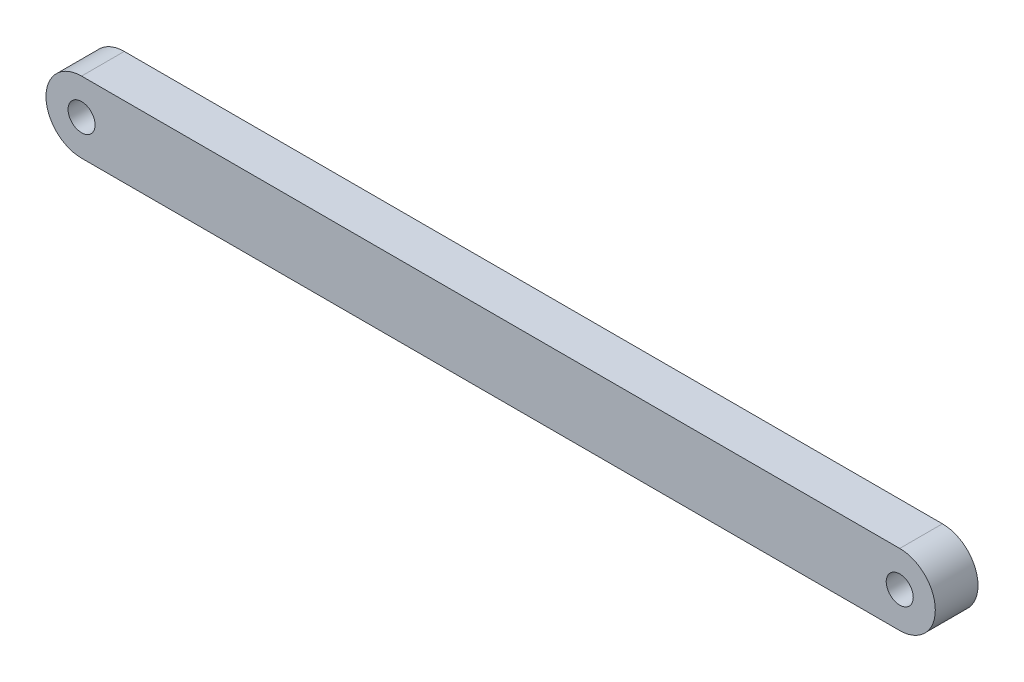
ISO-10303-21;
HEADER;
FILE_DESCRIPTION(('STEP AP214'),'2;1');
FILE_NAME('part.step','',(''),(''),'','','');
FILE_SCHEMA(('AUTOMOTIVE_DESIGN { 1 0 10303 214 1 1 1 1 }'));
ENDSEC;
DATA;
#1=APPLICATION_CONTEXT('core data for automotive mechanical design processes');
#2=APPLICATION_PROTOCOL_DEFINITION('international standard','automotive_design',2000,#1);
#3=PRODUCT_CONTEXT('',#1,'mechanical');
#4=PRODUCT('Part','Part','',(#3));
#5=PRODUCT_RELATED_PRODUCT_CATEGORY('part','',(#4));
#6=PRODUCT_DEFINITION_FORMATION('','',#4);
#7=PRODUCT_DEFINITION_CONTEXT('part definition',#1,'design');
#8=PRODUCT_DEFINITION('design','',#6,#7);
#9=PRODUCT_DEFINITION_SHAPE('','',#8);
#10=(LENGTH_UNIT() NAMED_UNIT(*) SI_UNIT(.MILLI.,.METRE.));
#11=(NAMED_UNIT(*) PLANE_ANGLE_UNIT() SI_UNIT($,.RADIAN.));
#12=(NAMED_UNIT(*) SI_UNIT($,.STERADIAN.) SOLID_ANGLE_UNIT());
#13=UNCERTAINTY_MEASURE_WITH_UNIT(LENGTH_MEASURE(1.E-05),#10,'distance_accuracy_value','');
#14=(GEOMETRIC_REPRESENTATION_CONTEXT(3) GLOBAL_UNCERTAINTY_ASSIGNED_CONTEXT((#13)) GLOBAL_UNIT_ASSIGNED_CONTEXT((#10,
#11,#12)) REPRESENTATION_CONTEXT('',''));
#15=CARTESIAN_POINT('',(0.,0.,0.));
#16=DIRECTION('',(0.,0.,1.));
#17=DIRECTION('',(1.,0.,0.));
#18=AXIS2_PLACEMENT_3D('',#15,#16,#17);
#19=CARTESIAN_POINT('',(57.5,0.,6.));
#20=DIRECTION('',(0.,0.,-1.));
#21=DIRECTION('',(-1.,0.,0.));
#22=AXIS2_PLACEMENT_3D('',#19,#20,#21);
#23=PLANE('',#22);
#24=CARTESIAN_POINT('',(57.5,0.,6.));
#25=DIRECTION('',(0.,0.,1.));
#26=DIRECTION('',(-1.,0.,0.));
#27=AXIS2_PLACEMENT_3D('',#24,#25,#26);
#28=CIRCLE('',#27,5.00000000000002);
#29=CARTESIAN_POINT('',(57.5,-5.00000000000002,6.));
#30=VERTEX_POINT('',#29);
#31=CARTESIAN_POINT('',(57.5,5.00000000000002,6.));
#32=VERTEX_POINT('',#31);
#33=EDGE_CURVE('E89',#30,#32,#28,.T.);
#34=ORIENTED_EDGE('',*,*,#33,.T.);
#35=DIRECTION('',(-1.,0.,0.));
#36=VECTOR('',#35,1.);
#37=CARTESIAN_POINT('',(-57.5,5.,6.));
#38=LINE('',#37,#36);
#39=CARTESIAN_POINT('',(-57.5,5.00000000000001,6.));
#40=VERTEX_POINT('',#39);
#41=EDGE_CURVE('E84',#32,#40,#38,.T.);
#42=ORIENTED_EDGE('',*,*,#41,.T.);
#43=CARTESIAN_POINT('',(-57.5,0.,6.));
#44=DIRECTION('',(0.,0.,1.));
#45=DIRECTION('',(1.,0.,0.));
#46=AXIS2_PLACEMENT_3D('',#43,#44,#45);
#47=CIRCLE('',#46,5.00000000000002);
#48=CARTESIAN_POINT('',(-57.5,-5.00000000000004,6.));
#49=VERTEX_POINT('',#48);
#50=EDGE_CURVE('E87',#40,#49,#47,.T.);
#51=ORIENTED_EDGE('',*,*,#50,.T.);
#52=DIRECTION('',(1.,0.,0.));
#53=VECTOR('',#52,1.);
#54=CARTESIAN_POINT('',(-57.5,-5.00000000000004,6.));
#55=LINE('',#54,#53);
#56=EDGE_CURVE('E54',#49,#30,#55,.T.);
#57=ORIENTED_EDGE('',*,*,#56,.T.);
#58=EDGE_LOOP('',(#34,#42,#51,#57));
#59=FACE_BOUND('',#58,.T.);
#60=CARTESIAN_POINT('',(-57.5,0.,6.));
#61=DIRECTION('',(0.,0.,1.));
#62=DIRECTION('',(1.,0.,0.));
#63=AXIS2_PLACEMENT_3D('',#60,#61,#62);
#64=CIRCLE('',#63,1.9);
#65=CARTESIAN_POINT('',(-55.6,0.,6.));
#66=VERTEX_POINT('',#65);
#67=EDGE_CURVE('E104',#66,#66,#64,.T.);
#68=ORIENTED_EDGE('',*,*,#67,.F.);
#69=EDGE_LOOP('',(#68));
#70=FACE_BOUND('',#69,.T.);
#71=CARTESIAN_POINT('',(57.5,0.,6.));
#72=DIRECTION('',(0.,0.,1.));
#73=DIRECTION('',(1.,0.,0.));
#74=AXIS2_PLACEMENT_3D('',#71,#72,#73);
#75=CIRCLE('',#74,1.9);
#76=CARTESIAN_POINT('',(59.4,0.,6.));
#77=VERTEX_POINT('',#76);
#78=EDGE_CURVE('E119',#77,#77,#75,.T.);
#79=ORIENTED_EDGE('',*,*,#78,.F.);
#80=EDGE_LOOP('',(#79));
#81=FACE_BOUND('',#80,.T.);
#82=ADVANCED_FACE('F37',(#59,#70,#81),#23,.F.);
#83=CARTESIAN_POINT('',(57.5,0.,0.));
#84=DIRECTION('',(0.,0.,-1.));
#85=DIRECTION('',(-1.,0.,0.));
#86=AXIS2_PLACEMENT_3D('',#83,#84,#85);
#87=PLANE('',#86);
#88=CARTESIAN_POINT('',(-57.5,0.,0.));
#89=DIRECTION('',(0.,0.,1.));
#90=DIRECTION('',(1.,0.,0.));
#91=AXIS2_PLACEMENT_3D('',#88,#89,#90);
#92=CIRCLE('',#91,1.9);
#93=CARTESIAN_POINT('',(-55.6,0.,0.));
#94=VERTEX_POINT('',#93);
#95=EDGE_CURVE('E116',#94,#94,#92,.T.);
#96=ORIENTED_EDGE('',*,*,#95,.T.);
#97=EDGE_LOOP('',(#96));
#98=FACE_BOUND('',#97,.T.);
#99=CARTESIAN_POINT('',(57.5,0.,0.));
#100=DIRECTION('',(0.,0.,1.));
#101=DIRECTION('',(-1.,0.,0.));
#102=AXIS2_PLACEMENT_3D('',#99,#100,#101);
#103=CIRCLE('',#102,5.00000000000002);
#104=CARTESIAN_POINT('',(57.5,-5.00000000000002,0.));
#105=VERTEX_POINT('',#104);
#106=CARTESIAN_POINT('',(57.5,5.00000000000002,0.));
#107=VERTEX_POINT('',#106);
#108=EDGE_CURVE('E101',#105,#107,#103,.T.);
#109=ORIENTED_EDGE('',*,*,#108,.F.);
#110=DIRECTION('',(1.,0.,0.));
#111=VECTOR('',#110,1.);
#112=CARTESIAN_POINT('',(-57.5,-5.00000000000004,0.));
#113=LINE('',#112,#111);
#114=CARTESIAN_POINT('',(-57.5,-5.00000000000004,0.));
#115=VERTEX_POINT('',#114);
#116=EDGE_CURVE('E77',#115,#105,#113,.T.);
#117=ORIENTED_EDGE('',*,*,#116,.F.);
#118=CARTESIAN_POINT('',(-57.5,0.,0.));
#119=DIRECTION('',(0.,0.,1.));
#120=DIRECTION('',(1.,0.,0.));
#121=AXIS2_PLACEMENT_3D('',#118,#119,#120);
#122=CIRCLE('',#121,5.00000000000002);
#123=CARTESIAN_POINT('',(-57.5,5.00000000000001,0.));
#124=VERTEX_POINT('',#123);
#125=EDGE_CURVE('E71',#124,#115,#122,.T.);
#126=ORIENTED_EDGE('',*,*,#125,.F.);
#127=DIRECTION('',(-1.,0.,0.));
#128=VECTOR('',#127,1.);
#129=CARTESIAN_POINT('',(-57.5,5.,0.));
#130=LINE('',#129,#128);
#131=EDGE_CURVE('E93',#107,#124,#130,.T.);
#132=ORIENTED_EDGE('',*,*,#131,.F.);
#133=EDGE_LOOP('',(#109,#117,#126,#132));
#134=FACE_BOUND('',#133,.T.);
#135=CARTESIAN_POINT('',(57.5,0.,0.));
#136=DIRECTION('',(0.,0.,1.));
#137=DIRECTION('',(1.,0.,0.));
#138=AXIS2_PLACEMENT_3D('',#135,#136,#137);
#139=CIRCLE('',#138,1.9);
#140=CARTESIAN_POINT('',(59.4,0.,0.));
#141=VERTEX_POINT('',#140);
#142=EDGE_CURVE('E122',#141,#141,#139,.T.);
#143=ORIENTED_EDGE('',*,*,#142,.T.);
#144=EDGE_LOOP('',(#143));
#145=FACE_BOUND('',#144,.T.);
#146=ADVANCED_FACE('F112',(#98,#134,#145),#87,.T.);
#147=CARTESIAN_POINT('',(57.5,0.,6.));
#148=DIRECTION('',(0.,0.,-1.));
#149=DIRECTION('',(-1.,0.,0.));
#150=AXIS2_PLACEMENT_3D('',#147,#148,#149);
#151=CYLINDRICAL_SURFACE('',#150,5.00000000000002);
#152=ORIENTED_EDGE('',*,*,#108,.T.);
#153=DIRECTION('',(0.,0.,-1.));
#154=VECTOR('',#153,1.);
#155=CARTESIAN_POINT('',(57.5,5.00000000000002,6.));
#156=LINE('',#155,#154);
#157=EDGE_CURVE('E11',#32,#107,#156,.T.);
#158=ORIENTED_EDGE('',*,*,#157,.F.);
#159=ORIENTED_EDGE('',*,*,#33,.F.);
#160=DIRECTION('',(0.,0.,-1.));
#161=VECTOR('',#160,1.);
#162=CARTESIAN_POINT('',(57.5,-5.00000000000002,6.));
#163=LINE('',#162,#161);
#164=EDGE_CURVE('E97',#30,#105,#163,.T.);
#165=ORIENTED_EDGE('',*,*,#164,.T.);
#166=EDGE_LOOP('',(#152,#158,#159,#165));
#167=FACE_BOUND('',#166,.T.);
#168=ADVANCED_FACE('F39',(#167),#151,.T.);
#169=CARTESIAN_POINT('',(-57.5,5.,6.));
#170=DIRECTION('',(0.,-1.,0.));
#171=DIRECTION('',(1.,0.,0.));
#172=AXIS2_PLACEMENT_3D('',#169,#170,#171);
#173=PLANE('',#172);
#174=ORIENTED_EDGE('',*,*,#131,.T.);
#175=DIRECTION('',(0.,0.,-1.));
#176=VECTOR('',#175,1.);
#177=CARTESIAN_POINT('',(-57.5,5.00000000000001,6.));
#178=LINE('',#177,#176);
#179=EDGE_CURVE('E46',#40,#124,#178,.T.);
#180=ORIENTED_EDGE('',*,*,#179,.F.);
#181=ORIENTED_EDGE('',*,*,#41,.F.);
#182=ORIENTED_EDGE('',*,*,#157,.T.);
#183=EDGE_LOOP('',(#174,#180,#181,#182));
#184=FACE_BOUND('',#183,.T.);
#185=ADVANCED_FACE('F92',(#184),#173,.F.);
#186=CARTESIAN_POINT('',(-57.5,0.,6.));
#187=DIRECTION('',(0.,0.,-1.));
#188=DIRECTION('',(-1.,0.,0.));
#189=AXIS2_PLACEMENT_3D('',#186,#187,#188);
#190=CYLINDRICAL_SURFACE('',#189,5.00000000000002);
#191=ORIENTED_EDGE('',*,*,#125,.T.);
#192=DIRECTION('',(0.,0.,-1.));
#193=VECTOR('',#192,1.);
#194=CARTESIAN_POINT('',(-57.5,-5.00000000000004,6.));
#195=LINE('',#194,#193);
#196=EDGE_CURVE('E94',#49,#115,#195,.T.);
#197=ORIENTED_EDGE('',*,*,#196,.F.);
#198=ORIENTED_EDGE('',*,*,#50,.F.);
#199=ORIENTED_EDGE('',*,*,#179,.T.);
#200=EDGE_LOOP('',(#191,#197,#198,#199));
#201=FACE_BOUND('',#200,.T.);
#202=ADVANCED_FACE('F95',(#201),#190,.T.);
#203=CARTESIAN_POINT('',(-57.5,-5.00000000000004,6.));
#204=DIRECTION('',(0.,1.,0.));
#205=DIRECTION('',(-1.,0.,0.));
#206=AXIS2_PLACEMENT_3D('',#203,#204,#205);
#207=PLANE('',#206);
#208=ORIENTED_EDGE('',*,*,#116,.T.);
#209=ORIENTED_EDGE('',*,*,#164,.F.);
#210=ORIENTED_EDGE('',*,*,#56,.F.);
#211=ORIENTED_EDGE('',*,*,#196,.T.);
#212=EDGE_LOOP('',(#208,#209,#210,#211));
#213=FACE_BOUND('',#212,.T.);
#214=ADVANCED_FACE('F109',(#213),#207,.F.);
#215=CARTESIAN_POINT('',(-57.5,0.,6.));
#216=DIRECTION('',(0.,0.,-1.));
#217=DIRECTION('',(-1.,0.,0.));
#218=AXIS2_PLACEMENT_3D('',#215,#216,#217);
#219=CYLINDRICAL_SURFACE('',#218,1.9);
#220=ORIENTED_EDGE('',*,*,#67,.T.);
#221=EDGE_LOOP('',(#220));
#222=FACE_BOUND('',#221,.T.);
#223=ORIENTED_EDGE('',*,*,#95,.F.);
#224=EDGE_LOOP('',(#223));
#225=FACE_BOUND('',#224,.T.);
#226=ADVANCED_FACE('F139',(#222,#225),#219,.F.);
#227=CARTESIAN_POINT('',(57.5,0.,6.));
#228=DIRECTION('',(0.,0.,-1.));
#229=DIRECTION('',(-1.,0.,0.));
#230=AXIS2_PLACEMENT_3D('',#227,#228,#229);
#231=CYLINDRICAL_SURFACE('',#230,1.9);
#232=ORIENTED_EDGE('',*,*,#78,.T.);
#233=EDGE_LOOP('',(#232));
#234=FACE_BOUND('',#233,.T.);
#235=ORIENTED_EDGE('',*,*,#142,.F.);
#236=EDGE_LOOP('',(#235));
#237=FACE_BOUND('',#236,.T.);
#238=ADVANCED_FACE('F128',(#234,#237),#231,.F.);
#239=CLOSED_SHELL('',(#82,#146,#168,#185,#202,#214,#226,#238));
#240=MANIFOLD_SOLID_BREP('B2',#239);
#241=ADVANCED_BREP_SHAPE_REPRESENTATION('',(#18,#240),#14);
#242=SHAPE_DEFINITION_REPRESENTATION(#9,#241);
ENDSEC;
END-ISO-10303-21;
